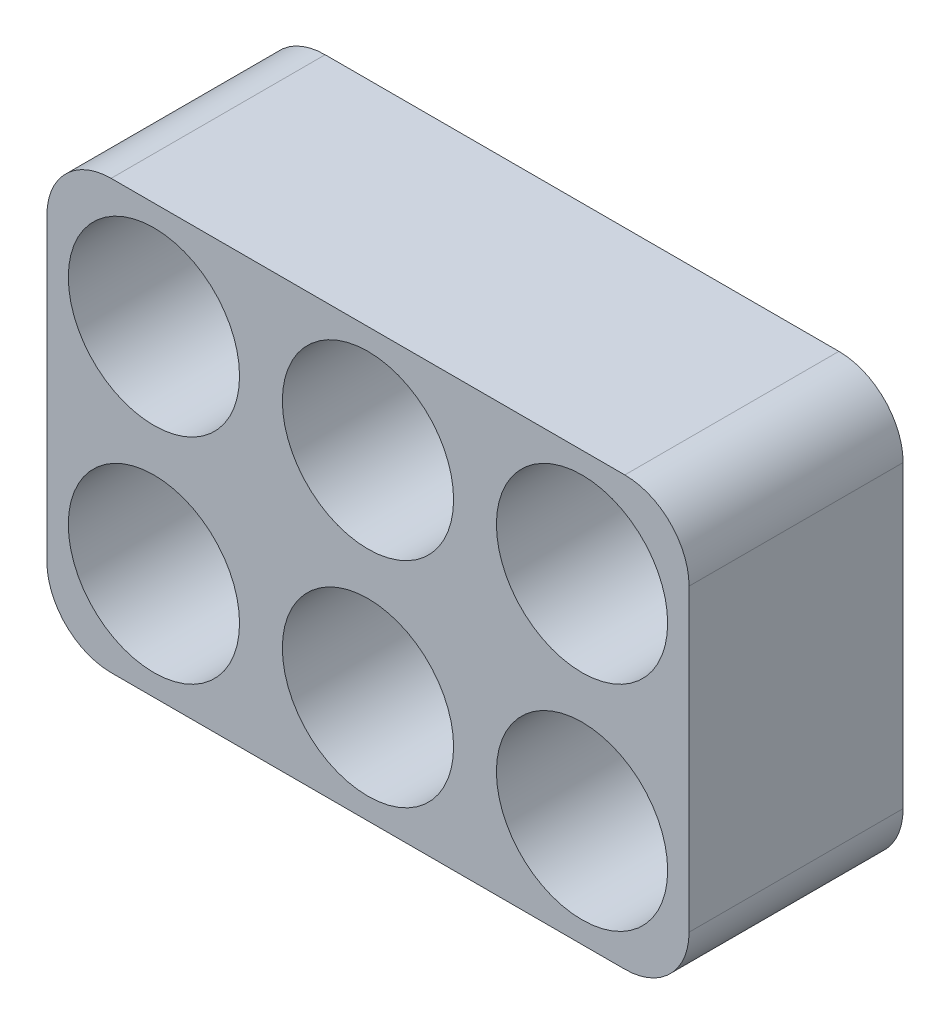
ISO-10303-21;
HEADER;
FILE_DESCRIPTION(('STEP AP214'),'2;1');
FILE_NAME('part.step','',(''),(''),'','','');
FILE_SCHEMA(('AUTOMOTIVE_DESIGN { 1 0 10303 214 1 1 1 1 }'));
ENDSEC;
DATA;
#1=APPLICATION_CONTEXT('core data for automotive mechanical design processes');
#2=APPLICATION_PROTOCOL_DEFINITION('international standard','automotive_design',2000,#1);
#3=PRODUCT_CONTEXT('',#1,'mechanical');
#4=PRODUCT('Part','Part','',(#3));
#5=PRODUCT_RELATED_PRODUCT_CATEGORY('part','',(#4));
#6=PRODUCT_DEFINITION_FORMATION('','',#4);
#7=PRODUCT_DEFINITION_CONTEXT('part definition',#1,'design');
#8=PRODUCT_DEFINITION('design','',#6,#7);
#9=PRODUCT_DEFINITION_SHAPE('','',#8);
#10=(LENGTH_UNIT() NAMED_UNIT(*) SI_UNIT(.MILLI.,.METRE.));
#11=(NAMED_UNIT(*) PLANE_ANGLE_UNIT() SI_UNIT($,.RADIAN.));
#12=(NAMED_UNIT(*) SI_UNIT($,.STERADIAN.) SOLID_ANGLE_UNIT());
#13=UNCERTAINTY_MEASURE_WITH_UNIT(LENGTH_MEASURE(1.E-05),#10,'distance_accuracy_value','');
#14=(GEOMETRIC_REPRESENTATION_CONTEXT(3) GLOBAL_UNCERTAINTY_ASSIGNED_CONTEXT((#13)) GLOBAL_UNIT_ASSIGNED_CONTEXT((#10,
#11,#12)) REPRESENTATION_CONTEXT('',''));
#15=CARTESIAN_POINT('',(0.,0.,0.));
#16=DIRECTION('',(0.,0.,1.));
#17=DIRECTION('',(1.,0.,0.));
#18=AXIS2_PLACEMENT_3D('',#15,#16,#17);
#19=CARTESIAN_POINT('',(-12.,-7.,10.));
#20=DIRECTION('',(0.,0.,-1.));
#21=DIRECTION('',(-1.,0.,0.));
#22=AXIS2_PLACEMENT_3D('',#19,#20,#21);
#23=PLANE('',#22);
#24=CARTESIAN_POINT('',(-12.,-7.,10.));
#25=DIRECTION('',(0.,0.,1.));
#26=DIRECTION('',(-1.,0.,0.));
#27=AXIS2_PLACEMENT_3D('',#24,#25,#26);
#28=CIRCLE('',#27,3.);
#29=CARTESIAN_POINT('',(-15.,-6.99999999999998,10.));
#30=VERTEX_POINT('',#29);
#31=CARTESIAN_POINT('',(-12.,-10.,10.));
#32=VERTEX_POINT('',#31);
#33=EDGE_CURVE('E153',#30,#32,#28,.T.);
#34=ORIENTED_EDGE('',*,*,#33,.T.);
#35=DIRECTION('',(1.,0.,0.));
#36=VECTOR('',#35,1.);
#37=CARTESIAN_POINT('',(-12.,-10.,10.));
#38=LINE('',#37,#36);
#39=CARTESIAN_POINT('',(12.,-10.,10.));
#40=VERTEX_POINT('',#39);
#41=EDGE_CURVE('E101',#32,#40,#38,.T.);
#42=ORIENTED_EDGE('',*,*,#41,.T.);
#43=CARTESIAN_POINT('',(12.,-7.,10.));
#44=DIRECTION('',(0.,0.,1.));
#45=DIRECTION('',(1.,0.,0.));
#46=AXIS2_PLACEMENT_3D('',#43,#44,#45);
#47=CIRCLE('',#46,3.);
#48=CARTESIAN_POINT('',(15.,-7.,10.));
#49=VERTEX_POINT('',#48);
#50=EDGE_CURVE('E168',#40,#49,#47,.T.);
#51=ORIENTED_EDGE('',*,*,#50,.T.);
#52=DIRECTION('',(0.,1.,0.));
#53=VECTOR('',#52,1.);
#54=CARTESIAN_POINT('',(15.,-6.99999999999998,10.));
#55=LINE('',#54,#53);
#56=CARTESIAN_POINT('',(15.,6.99999999999998,10.));
#57=VERTEX_POINT('',#56);
#58=EDGE_CURVE('E181',#49,#57,#55,.T.);
#59=ORIENTED_EDGE('',*,*,#58,.T.);
#60=CARTESIAN_POINT('',(12.,7.,10.));
#61=DIRECTION('',(0.,0.,1.));
#62=DIRECTION('',(-1.,0.,0.));
#63=AXIS2_PLACEMENT_3D('',#60,#61,#62);
#64=CIRCLE('',#63,3.);
#65=CARTESIAN_POINT('',(12.,10.,10.));
#66=VERTEX_POINT('',#65);
#67=EDGE_CURVE('E120',#57,#66,#64,.T.);
#68=ORIENTED_EDGE('',*,*,#67,.T.);
#69=DIRECTION('',(-1.,0.,0.));
#70=VECTOR('',#69,1.);
#71=CARTESIAN_POINT('',(-12.,10.,10.));
#72=LINE('',#71,#70);
#73=CARTESIAN_POINT('',(-12.,10.,10.));
#74=VERTEX_POINT('',#73);
#75=EDGE_CURVE('E114',#66,#74,#72,.T.);
#76=ORIENTED_EDGE('',*,*,#75,.T.);
#77=CARTESIAN_POINT('',(-12.,7.,10.));
#78=DIRECTION('',(0.,0.,1.));
#79=DIRECTION('',(-1.,0.,0.));
#80=AXIS2_PLACEMENT_3D('',#77,#78,#79);
#81=CIRCLE('',#80,3.);
#82=CARTESIAN_POINT('',(-15.,6.99999999999998,10.));
#83=VERTEX_POINT('',#82);
#84=EDGE_CURVE('E118',#74,#83,#81,.T.);
#85=ORIENTED_EDGE('',*,*,#84,.T.);
#86=DIRECTION('',(0.,-1.,0.));
#87=VECTOR('',#86,1.);
#88=CARTESIAN_POINT('',(-15.,-6.99999999999998,10.));
#89=LINE('',#88,#87);
#90=EDGE_CURVE('E58',#83,#30,#89,.T.);
#91=ORIENTED_EDGE('',*,*,#90,.T.);
#92=EDGE_LOOP('',(#34,#42,#51,#59,#68,#76,#85,#91));
#93=FACE_BOUND('',#92,.T.);
#94=CARTESIAN_POINT('',(-10.,5.,10.));
#95=DIRECTION('',(0.,0.,1.));
#96=DIRECTION('',(1.,0.,0.));
#97=AXIS2_PLACEMENT_3D('',#94,#95,#96);
#98=CIRCLE('',#97,4.);
#99=CARTESIAN_POINT('',(-6.,5.,10.));
#100=VERTEX_POINT('',#99);
#101=EDGE_CURVE('E142',#100,#100,#98,.T.);
#102=ORIENTED_EDGE('',*,*,#101,.F.);
#103=EDGE_LOOP('',(#102));
#104=FACE_BOUND('',#103,.T.);
#105=CARTESIAN_POINT('',(0.,5.,10.));
#106=DIRECTION('',(0.,0.,1.));
#107=DIRECTION('',(1.,0.,0.));
#108=AXIS2_PLACEMENT_3D('',#105,#106,#107);
#109=CIRCLE('',#108,4.);
#110=CARTESIAN_POINT('',(4.,5.,10.));
#111=VERTEX_POINT('',#110);
#112=EDGE_CURVE('E190',#111,#111,#109,.T.);
#113=ORIENTED_EDGE('',*,*,#112,.F.);
#114=EDGE_LOOP('',(#113));
#115=FACE_BOUND('',#114,.T.);
#116=CARTESIAN_POINT('',(10.,5.,10.));
#117=DIRECTION('',(0.,0.,1.));
#118=DIRECTION('',(1.,0.,0.));
#119=AXIS2_PLACEMENT_3D('',#116,#117,#118);
#120=CIRCLE('',#119,4.);
#121=CARTESIAN_POINT('',(14.,5.,10.));
#122=VERTEX_POINT('',#121);
#123=EDGE_CURVE('E196',#122,#122,#120,.T.);
#124=ORIENTED_EDGE('',*,*,#123,.F.);
#125=EDGE_LOOP('',(#124));
#126=FACE_BOUND('',#125,.T.);
#127=CARTESIAN_POINT('',(1.04083408558608E-13,-5.,10.));
#128=DIRECTION('',(0.,0.,1.));
#129=DIRECTION('',(1.,0.,0.));
#130=AXIS2_PLACEMENT_3D('',#127,#128,#129);
#131=CIRCLE('',#130,4.);
#132=CARTESIAN_POINT('',(4.0000000000001,-5.,10.));
#133=VERTEX_POINT('',#132);
#134=EDGE_CURVE('E202',#133,#133,#131,.T.);
#135=ORIENTED_EDGE('',*,*,#134,.F.);
#136=EDGE_LOOP('',(#135));
#137=FACE_BOUND('',#136,.T.);
#138=CARTESIAN_POINT('',(10.0000000000001,-5.,10.));
#139=DIRECTION('',(0.,0.,1.));
#140=DIRECTION('',(1.,0.,0.));
#141=AXIS2_PLACEMENT_3D('',#138,#139,#140);
#142=CIRCLE('',#141,4.);
#143=CARTESIAN_POINT('',(14.0000000000001,-5.,10.));
#144=VERTEX_POINT('',#143);
#145=EDGE_CURVE('E208',#144,#144,#142,.T.);
#146=ORIENTED_EDGE('',*,*,#145,.F.);
#147=EDGE_LOOP('',(#146));
#148=FACE_BOUND('',#147,.T.);
#149=CARTESIAN_POINT('',(-9.9999999999999,-5.,10.));
#150=DIRECTION('',(0.,0.,1.));
#151=DIRECTION('',(1.,0.,0.));
#152=AXIS2_PLACEMENT_3D('',#149,#150,#151);
#153=CIRCLE('',#152,4.);
#154=CARTESIAN_POINT('',(-5.9999999999999,-5.,10.));
#155=VERTEX_POINT('',#154);
#156=EDGE_CURVE('E214',#155,#155,#153,.T.);
#157=ORIENTED_EDGE('',*,*,#156,.F.);
#158=EDGE_LOOP('',(#157));
#159=FACE_BOUND('',#158,.T.);
#160=ADVANCED_FACE('F41',(#93,#104,#115,#126,#137,#148,#159),#23,.F.);
#161=CARTESIAN_POINT('',(-12.,-7.,0.));
#162=DIRECTION('',(0.,0.,-1.));
#163=DIRECTION('',(-1.,0.,0.));
#164=AXIS2_PLACEMENT_3D('',#161,#162,#163);
#165=PLANE('',#164);
#166=CARTESIAN_POINT('',(10.0000000000001,-5.,0.));
#167=DIRECTION('',(0.,0.,1.));
#168=DIRECTION('',(1.,0.,0.));
#169=AXIS2_PLACEMENT_3D('',#166,#167,#168);
#170=CIRCLE('',#169,4.);
#171=CARTESIAN_POINT('',(14.0000000000001,-5.,0.));
#172=VERTEX_POINT('',#171);
#173=EDGE_CURVE('E211',#172,#172,#170,.T.);
#174=ORIENTED_EDGE('',*,*,#173,.T.);
#175=EDGE_LOOP('',(#174));
#176=FACE_BOUND('',#175,.T.);
#177=CARTESIAN_POINT('',(10.,5.,0.));
#178=DIRECTION('',(0.,0.,1.));
#179=DIRECTION('',(1.,0.,0.));
#180=AXIS2_PLACEMENT_3D('',#177,#178,#179);
#181=CIRCLE('',#180,4.);
#182=CARTESIAN_POINT('',(14.,5.,0.));
#183=VERTEX_POINT('',#182);
#184=EDGE_CURVE('E199',#183,#183,#181,.T.);
#185=ORIENTED_EDGE('',*,*,#184,.T.);
#186=EDGE_LOOP('',(#185));
#187=FACE_BOUND('',#186,.T.);
#188=CARTESIAN_POINT('',(-10.,5.,0.));
#189=DIRECTION('',(0.,0.,1.));
#190=DIRECTION('',(1.,0.,0.));
#191=AXIS2_PLACEMENT_3D('',#188,#189,#190);
#192=CIRCLE('',#191,4.);
#193=CARTESIAN_POINT('',(-6.,5.,0.));
#194=VERTEX_POINT('',#193);
#195=EDGE_CURVE('E187',#194,#194,#192,.T.);
#196=ORIENTED_EDGE('',*,*,#195,.T.);
#197=EDGE_LOOP('',(#196));
#198=FACE_BOUND('',#197,.T.);
#199=CARTESIAN_POINT('',(-12.,-7.,0.));
#200=DIRECTION('',(0.,0.,1.));
#201=DIRECTION('',(-1.,0.,0.));
#202=AXIS2_PLACEMENT_3D('',#199,#200,#201);
#203=CIRCLE('',#202,3.);
#204=CARTESIAN_POINT('',(-15.,-6.99999999999998,0.));
#205=VERTEX_POINT('',#204);
#206=CARTESIAN_POINT('',(-12.,-10.,0.));
#207=VERTEX_POINT('',#206);
#208=EDGE_CURVE('E138',#205,#207,#203,.T.);
#209=ORIENTED_EDGE('',*,*,#208,.F.);
#210=DIRECTION('',(0.,-1.,0.));
#211=VECTOR('',#210,1.);
#212=CARTESIAN_POINT('',(-15.,-6.99999999999998,0.));
#213=LINE('',#212,#211);
#214=CARTESIAN_POINT('',(-15.,6.99999999999998,0.));
#215=VERTEX_POINT('',#214);
#216=EDGE_CURVE('E93',#215,#205,#213,.T.);
#217=ORIENTED_EDGE('',*,*,#216,.F.);
#218=CARTESIAN_POINT('',(-12.,7.,0.));
#219=DIRECTION('',(0.,0.,1.));
#220=DIRECTION('',(-1.,0.,0.));
#221=AXIS2_PLACEMENT_3D('',#218,#219,#220);
#222=CIRCLE('',#221,3.);
#223=CARTESIAN_POINT('',(-12.,10.,0.));
#224=VERTEX_POINT('',#223);
#225=EDGE_CURVE('E87',#224,#215,#222,.T.);
#226=ORIENTED_EDGE('',*,*,#225,.F.);
#227=DIRECTION('',(-1.,0.,0.));
#228=VECTOR('',#227,1.);
#229=CARTESIAN_POINT('',(-12.,10.,0.));
#230=LINE('',#229,#228);
#231=CARTESIAN_POINT('',(12.,10.,0.));
#232=VERTEX_POINT('',#231);
#233=EDGE_CURVE('E128',#232,#224,#230,.T.);
#234=ORIENTED_EDGE('',*,*,#233,.F.);
#235=CARTESIAN_POINT('',(12.,7.,0.));
#236=DIRECTION('',(0.,0.,1.));
#237=DIRECTION('',(-1.,0.,0.));
#238=AXIS2_PLACEMENT_3D('',#235,#236,#237);
#239=CIRCLE('',#238,3.);
#240=CARTESIAN_POINT('',(15.,6.99999999999998,0.));
#241=VERTEX_POINT('',#240);
#242=EDGE_CURVE('E148',#241,#232,#239,.T.);
#243=ORIENTED_EDGE('',*,*,#242,.F.);
#244=DIRECTION('',(0.,1.,0.));
#245=VECTOR('',#244,1.);
#246=CARTESIAN_POINT('',(15.,-6.99999999999998,0.));
#247=LINE('',#246,#245);
#248=CARTESIAN_POINT('',(15.,-7.,0.));
#249=VERTEX_POINT('',#248);
#250=EDGE_CURVE('E146',#249,#241,#247,.T.);
#251=ORIENTED_EDGE('',*,*,#250,.F.);
#252=CARTESIAN_POINT('',(12.,-7.,0.));
#253=DIRECTION('',(0.,0.,1.));
#254=DIRECTION('',(1.,0.,0.));
#255=AXIS2_PLACEMENT_3D('',#252,#253,#254);
#256=CIRCLE('',#255,3.);
#257=CARTESIAN_POINT('',(12.,-10.,0.));
#258=VERTEX_POINT('',#257);
#259=EDGE_CURVE('E144',#258,#249,#256,.T.);
#260=ORIENTED_EDGE('',*,*,#259,.F.);
#261=DIRECTION('',(1.,0.,0.));
#262=VECTOR('',#261,1.);
#263=CARTESIAN_POINT('',(-12.,-10.,0.));
#264=LINE('',#263,#262);
#265=EDGE_CURVE('E141',#207,#258,#264,.T.);
#266=ORIENTED_EDGE('',*,*,#265,.F.);
#267=EDGE_LOOP('',(#209,#217,#226,#234,#243,#251,#260,#266));
#268=FACE_BOUND('',#267,.T.);
#269=CARTESIAN_POINT('',(0.,5.,0.));
#270=DIRECTION('',(0.,0.,1.));
#271=DIRECTION('',(1.,0.,0.));
#272=AXIS2_PLACEMENT_3D('',#269,#270,#271);
#273=CIRCLE('',#272,4.);
#274=CARTESIAN_POINT('',(4.,5.,0.));
#275=VERTEX_POINT('',#274);
#276=EDGE_CURVE('E193',#275,#275,#273,.T.);
#277=ORIENTED_EDGE('',*,*,#276,.T.);
#278=EDGE_LOOP('',(#277));
#279=FACE_BOUND('',#278,.T.);
#280=CARTESIAN_POINT('',(1.04083408558608E-13,-5.,0.));
#281=DIRECTION('',(0.,0.,1.));
#282=DIRECTION('',(1.,0.,0.));
#283=AXIS2_PLACEMENT_3D('',#280,#281,#282);
#284=CIRCLE('',#283,4.);
#285=CARTESIAN_POINT('',(4.0000000000001,-5.,0.));
#286=VERTEX_POINT('',#285);
#287=EDGE_CURVE('E205',#286,#286,#284,.T.);
#288=ORIENTED_EDGE('',*,*,#287,.T.);
#289=EDGE_LOOP('',(#288));
#290=FACE_BOUND('',#289,.T.);
#291=CARTESIAN_POINT('',(-9.9999999999999,-5.,0.));
#292=DIRECTION('',(0.,0.,1.));
#293=DIRECTION('',(1.,0.,0.));
#294=AXIS2_PLACEMENT_3D('',#291,#292,#293);
#295=CIRCLE('',#294,4.);
#296=CARTESIAN_POINT('',(-5.9999999999999,-5.,0.));
#297=VERTEX_POINT('',#296);
#298=EDGE_CURVE('E217',#297,#297,#295,.T.);
#299=ORIENTED_EDGE('',*,*,#298,.T.);
#300=EDGE_LOOP('',(#299));
#301=FACE_BOUND('',#300,.T.);
#302=ADVANCED_FACE('F172',(#176,#187,#198,#268,#279,#290,#301),#165,.T.);
#303=CARTESIAN_POINT('',(-12.,-7.,10.));
#304=DIRECTION('',(0.,0.,-1.));
#305=DIRECTION('',(-1.,0.,0.));
#306=AXIS2_PLACEMENT_3D('',#303,#304,#305);
#307=CYLINDRICAL_SURFACE('',#306,3.);
#308=ORIENTED_EDGE('',*,*,#208,.T.);
#309=DIRECTION('',(0.,0.,-1.));
#310=VECTOR('',#309,1.);
#311=CARTESIAN_POINT('',(-12.,-10.,10.));
#312=LINE('',#311,#310);
#313=EDGE_CURVE('E11',#32,#207,#312,.T.);
#314=ORIENTED_EDGE('',*,*,#313,.F.);
#315=ORIENTED_EDGE('',*,*,#33,.F.);
#316=DIRECTION('',(0.,0.,-1.));
#317=VECTOR('',#316,1.);
#318=CARTESIAN_POINT('',(-15.,-6.99999999999998,10.));
#319=LINE('',#318,#317);
#320=EDGE_CURVE('E134',#30,#205,#319,.T.);
#321=ORIENTED_EDGE('',*,*,#320,.T.);
#322=EDGE_LOOP('',(#308,#314,#315,#321));
#323=FACE_BOUND('',#322,.T.);
#324=ADVANCED_FACE('F43',(#323),#307,.T.);
#325=CARTESIAN_POINT('',(-12.,-10.,10.));
#326=DIRECTION('',(0.,1.,0.));
#327=DIRECTION('',(0.,0.,1.));
#328=AXIS2_PLACEMENT_3D('',#325,#326,#327);
#329=PLANE('',#328);
#330=ORIENTED_EDGE('',*,*,#265,.T.);
#331=DIRECTION('',(0.,0.,-1.));
#332=VECTOR('',#331,1.);
#333=CARTESIAN_POINT('',(12.,-10.,10.));
#334=LINE('',#333,#332);
#335=EDGE_CURVE('E50',#40,#258,#334,.T.);
#336=ORIENTED_EDGE('',*,*,#335,.F.);
#337=ORIENTED_EDGE('',*,*,#41,.F.);
#338=ORIENTED_EDGE('',*,*,#313,.T.);
#339=EDGE_LOOP('',(#330,#336,#337,#338));
#340=FACE_BOUND('',#339,.T.);
#341=ADVANCED_FACE('F249',(#340),#329,.F.);
#342=CARTESIAN_POINT('',(12.,-7.,10.));
#343=DIRECTION('',(0.,0.,-1.));
#344=DIRECTION('',(-1.,0.,0.));
#345=AXIS2_PLACEMENT_3D('',#342,#343,#344);
#346=CYLINDRICAL_SURFACE('',#345,3.);
#347=ORIENTED_EDGE('',*,*,#259,.T.);
#348=DIRECTION('',(0.,0.,-1.));
#349=VECTOR('',#348,1.);
#350=CARTESIAN_POINT('',(15.,-7.,10.));
#351=LINE('',#350,#349);
#352=EDGE_CURVE('E160',#49,#249,#351,.T.);
#353=ORIENTED_EDGE('',*,*,#352,.F.);
#354=ORIENTED_EDGE('',*,*,#50,.F.);
#355=ORIENTED_EDGE('',*,*,#335,.T.);
#356=EDGE_LOOP('',(#347,#353,#354,#355));
#357=FACE_BOUND('',#356,.T.);
#358=ADVANCED_FACE('F166',(#357),#346,.T.);
#359=CARTESIAN_POINT('',(15.,-6.99999999999998,10.));
#360=DIRECTION('',(-1.,0.,0.));
#361=DIRECTION('',(0.,0.,1.));
#362=AXIS2_PLACEMENT_3D('',#359,#360,#361);
#363=PLANE('',#362);
#364=ORIENTED_EDGE('',*,*,#250,.T.);
#365=DIRECTION('',(0.,0.,-1.));
#366=VECTOR('',#365,1.);
#367=CARTESIAN_POINT('',(15.,6.99999999999998,10.));
#368=LINE('',#367,#366);
#369=EDGE_CURVE('E157',#57,#241,#368,.T.);
#370=ORIENTED_EDGE('',*,*,#369,.F.);
#371=ORIENTED_EDGE('',*,*,#58,.F.);
#372=ORIENTED_EDGE('',*,*,#352,.T.);
#373=EDGE_LOOP('',(#364,#370,#371,#372));
#374=FACE_BOUND('',#373,.T.);
#375=ADVANCED_FACE('F177',(#374),#363,.F.);
#376=CARTESIAN_POINT('',(12.,7.,10.));
#377=DIRECTION('',(0.,0.,-1.));
#378=DIRECTION('',(-1.,0.,0.));
#379=AXIS2_PLACEMENT_3D('',#376,#377,#378);
#380=CYLINDRICAL_SURFACE('',#379,3.);
#381=ORIENTED_EDGE('',*,*,#242,.T.);
#382=DIRECTION('',(0.,0.,-1.));
#383=VECTOR('',#382,1.);
#384=CARTESIAN_POINT('',(12.,10.,10.));
#385=LINE('',#384,#383);
#386=EDGE_CURVE('E129',#66,#232,#385,.T.);
#387=ORIENTED_EDGE('',*,*,#386,.F.);
#388=ORIENTED_EDGE('',*,*,#67,.F.);
#389=ORIENTED_EDGE('',*,*,#369,.T.);
#390=EDGE_LOOP('',(#381,#387,#388,#389));
#391=FACE_BOUND('',#390,.T.);
#392=ADVANCED_FACE('F180',(#391),#380,.T.);
#393=CARTESIAN_POINT('',(-12.,10.,10.));
#394=DIRECTION('',(0.,-1.,0.));
#395=DIRECTION('',(0.,0.,-1.));
#396=AXIS2_PLACEMENT_3D('',#393,#394,#395);
#397=PLANE('',#396);
#398=ORIENTED_EDGE('',*,*,#233,.T.);
#399=DIRECTION('',(0.,0.,-1.));
#400=VECTOR('',#399,1.);
#401=CARTESIAN_POINT('',(-12.,10.,10.));
#402=LINE('',#401,#400);
#403=EDGE_CURVE('E125',#74,#224,#402,.T.);
#404=ORIENTED_EDGE('',*,*,#403,.F.);
#405=ORIENTED_EDGE('',*,*,#75,.F.);
#406=ORIENTED_EDGE('',*,*,#386,.T.);
#407=EDGE_LOOP('',(#398,#404,#405,#406));
#408=FACE_BOUND('',#407,.T.);
#409=ADVANCED_FACE('F126',(#408),#397,.F.);
#410=CARTESIAN_POINT('',(-12.,7.,10.));
#411=DIRECTION('',(0.,0.,-1.));
#412=DIRECTION('',(-1.,0.,0.));
#413=AXIS2_PLACEMENT_3D('',#410,#411,#412);
#414=CYLINDRICAL_SURFACE('',#413,3.);
#415=ORIENTED_EDGE('',*,*,#225,.T.);
#416=DIRECTION('',(0.,0.,-1.));
#417=VECTOR('',#416,1.);
#418=CARTESIAN_POINT('',(-15.,6.99999999999998,10.));
#419=LINE('',#418,#417);
#420=EDGE_CURVE('E130',#83,#215,#419,.T.);
#421=ORIENTED_EDGE('',*,*,#420,.F.);
#422=ORIENTED_EDGE('',*,*,#84,.F.);
#423=ORIENTED_EDGE('',*,*,#403,.T.);
#424=EDGE_LOOP('',(#415,#421,#422,#423));
#425=FACE_BOUND('',#424,.T.);
#426=ADVANCED_FACE('F132',(#425),#414,.T.);
#427=CARTESIAN_POINT('',(-15.,-6.99999999999998,10.));
#428=DIRECTION('',(1.,0.,0.));
#429=DIRECTION('',(0.,0.,-1.));
#430=AXIS2_PLACEMENT_3D('',#427,#428,#429);
#431=PLANE('',#430);
#432=ORIENTED_EDGE('',*,*,#216,.T.);
#433=ORIENTED_EDGE('',*,*,#320,.F.);
#434=ORIENTED_EDGE('',*,*,#90,.F.);
#435=ORIENTED_EDGE('',*,*,#420,.T.);
#436=EDGE_LOOP('',(#432,#433,#434,#435));
#437=FACE_BOUND('',#436,.T.);
#438=ADVANCED_FACE('F237',(#437),#431,.F.);
#439=CARTESIAN_POINT('',(-10.,5.,10.));
#440=DIRECTION('',(0.,0.,-1.));
#441=DIRECTION('',(-1.,0.,0.));
#442=AXIS2_PLACEMENT_3D('',#439,#440,#441);
#443=CYLINDRICAL_SURFACE('',#442,4.);
#444=ORIENTED_EDGE('',*,*,#101,.T.);
#445=EDGE_LOOP('',(#444));
#446=FACE_BOUND('',#445,.T.);
#447=ORIENTED_EDGE('',*,*,#195,.F.);
#448=EDGE_LOOP('',(#447));
#449=FACE_BOUND('',#448,.T.);
#450=ADVANCED_FACE('F234',(#446,#449),#443,.F.);
#451=CARTESIAN_POINT('',(0.,5.,10.));
#452=DIRECTION('',(0.,0.,-1.));
#453=DIRECTION('',(-1.,0.,0.));
#454=AXIS2_PLACEMENT_3D('',#451,#452,#453);
#455=CYLINDRICAL_SURFACE('',#454,4.);
#456=ORIENTED_EDGE('',*,*,#112,.T.);
#457=EDGE_LOOP('',(#456));
#458=FACE_BOUND('',#457,.T.);
#459=ORIENTED_EDGE('',*,*,#276,.F.);
#460=EDGE_LOOP('',(#459));
#461=FACE_BOUND('',#460,.T.);
#462=ADVANCED_FACE('F347',(#458,#461),#455,.F.);
#463=CARTESIAN_POINT('',(10.,5.,10.));
#464=DIRECTION('',(0.,0.,-1.));
#465=DIRECTION('',(-1.,0.,0.));
#466=AXIS2_PLACEMENT_3D('',#463,#464,#465);
#467=CYLINDRICAL_SURFACE('',#466,4.);
#468=ORIENTED_EDGE('',*,*,#123,.T.);
#469=EDGE_LOOP('',(#468));
#470=FACE_BOUND('',#469,.T.);
#471=ORIENTED_EDGE('',*,*,#184,.F.);
#472=EDGE_LOOP('',(#471));
#473=FACE_BOUND('',#472,.T.);
#474=ADVANCED_FACE('F358',(#470,#473),#467,.F.);
#475=CARTESIAN_POINT('',(1.04083408558608E-13,-5.,10.));
#476=DIRECTION('',(0.,0.,-1.));
#477=DIRECTION('',(-1.,0.,0.));
#478=AXIS2_PLACEMENT_3D('',#475,#476,#477);
#479=CYLINDRICAL_SURFACE('',#478,4.);
#480=ORIENTED_EDGE('',*,*,#134,.T.);
#481=EDGE_LOOP('',(#480));
#482=FACE_BOUND('',#481,.T.);
#483=ORIENTED_EDGE('',*,*,#287,.F.);
#484=EDGE_LOOP('',(#483));
#485=FACE_BOUND('',#484,.T.);
#486=ADVANCED_FACE('F369',(#482,#485),#479,.F.);
#487=CARTESIAN_POINT('',(10.0000000000001,-5.,10.));
#488=DIRECTION('',(0.,0.,-1.));
#489=DIRECTION('',(-1.,0.,0.));
#490=AXIS2_PLACEMENT_3D('',#487,#488,#489);
#491=CYLINDRICAL_SURFACE('',#490,4.);
#492=ORIENTED_EDGE('',*,*,#145,.T.);
#493=EDGE_LOOP('',(#492));
#494=FACE_BOUND('',#493,.T.);
#495=ORIENTED_EDGE('',*,*,#173,.F.);
#496=EDGE_LOOP('',(#495));
#497=FACE_BOUND('',#496,.T.);
#498=ADVANCED_FACE('F381',(#494,#497),#491,.F.);
#499=CARTESIAN_POINT('',(-9.9999999999999,-5.,10.));
#500=DIRECTION('',(0.,0.,-1.));
#501=DIRECTION('',(-1.,0.,0.));
#502=AXIS2_PLACEMENT_3D('',#499,#500,#501);
#503=CYLINDRICAL_SURFACE('',#502,4.);
#504=ORIENTED_EDGE('',*,*,#156,.T.);
#505=EDGE_LOOP('',(#504));
#506=FACE_BOUND('',#505,.T.);
#507=ORIENTED_EDGE('',*,*,#298,.F.);
#508=EDGE_LOOP('',(#507));
#509=FACE_BOUND('',#508,.T.);
#510=ADVANCED_FACE('F223',(#506,#509),#503,.F.);
#511=CLOSED_SHELL('',(#160,#302,#324,#341,#358,#375,#392,#409,#426,#438,#450,#462,#474,#486,
#498,#510));
#512=MANIFOLD_SOLID_BREP('B2',#511);
#513=ADVANCED_BREP_SHAPE_REPRESENTATION('',(#18,#512),#14);
#514=SHAPE_DEFINITION_REPRESENTATION(#9,#513);
ENDSEC;
END-ISO-10303-21;
